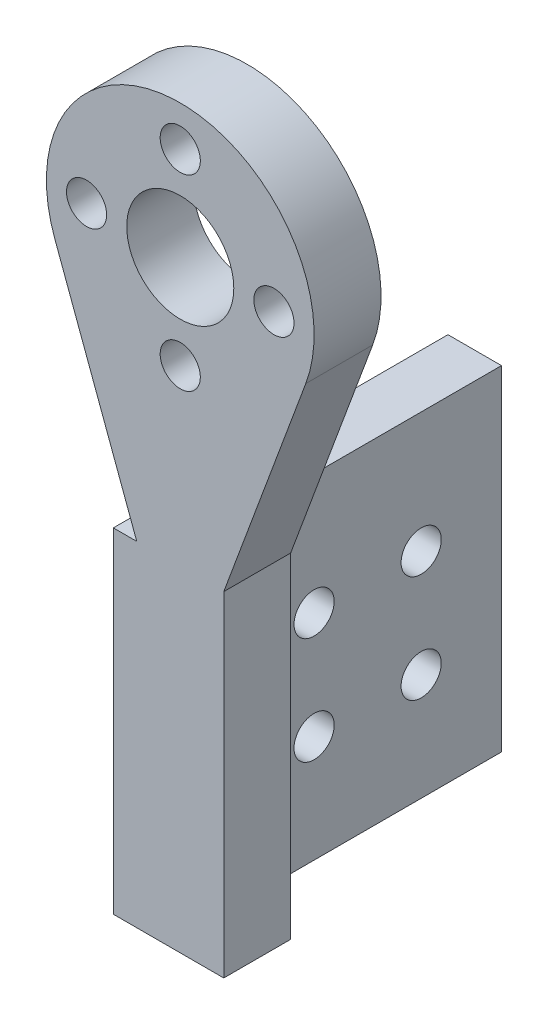
ISO-10303-21;
HEADER;
FILE_DESCRIPTION(('STEP AP214'),'2;1');
FILE_NAME('part.step','',(''),(''),'','','');
FILE_SCHEMA(('AUTOMOTIVE_DESIGN { 1 0 10303 214 1 1 1 1 }'));
ENDSEC;
DATA;
#1=APPLICATION_CONTEXT('core data for automotive mechanical design processes');
#2=APPLICATION_PROTOCOL_DEFINITION('international standard','automotive_design',2000,#1);
#3=PRODUCT_CONTEXT('',#1,'mechanical');
#4=PRODUCT('Part','Part','',(#3));
#5=PRODUCT_RELATED_PRODUCT_CATEGORY('part','',(#4));
#6=PRODUCT_DEFINITION_FORMATION('','',#4);
#7=PRODUCT_DEFINITION_CONTEXT('part definition',#1,'design');
#8=PRODUCT_DEFINITION('design','',#6,#7);
#9=PRODUCT_DEFINITION_SHAPE('','',#8);
#10=(LENGTH_UNIT() NAMED_UNIT(*) SI_UNIT(.MILLI.,.METRE.));
#11=(NAMED_UNIT(*) PLANE_ANGLE_UNIT() SI_UNIT($,.RADIAN.));
#12=(NAMED_UNIT(*) SI_UNIT($,.STERADIAN.) SOLID_ANGLE_UNIT());
#13=UNCERTAINTY_MEASURE_WITH_UNIT(LENGTH_MEASURE(1.E-05),#10,'distance_accuracy_value','');
#14=(GEOMETRIC_REPRESENTATION_CONTEXT(3) GLOBAL_UNCERTAINTY_ASSIGNED_CONTEXT((#13)) GLOBAL_UNIT_ASSIGNED_CONTEXT((#10,
#11,#12)) REPRESENTATION_CONTEXT('',''));
#15=CARTESIAN_POINT('',(0.,0.,0.));
#16=DIRECTION('',(0.,0.,1.));
#17=DIRECTION('',(1.,0.,0.));
#18=AXIS2_PLACEMENT_3D('',#15,#16,#17);
#19=CARTESIAN_POINT('',(0.,0.,5.));
#20=DIRECTION('',(0.,0.,-1.));
#21=DIRECTION('',(-1.,0.,0.));
#22=AXIS2_PLACEMENT_3D('',#19,#20,#21);
#23=PLANE('',#22);
#24=CARTESIAN_POINT('',(6.66884865732704,32.3881145780887,5.));
#25=DIRECTION('',(0.,0.,1.));
#26=DIRECTION('',(1.,0.,0.));
#27=AXIS2_PLACEMENT_3D('',#24,#25,#26);
#28=CIRCLE('',#27,1.5);
#29=CARTESIAN_POINT('',(8.16884865732705,32.3881145780887,5.));
#30=VERTEX_POINT('',#29);
#31=EDGE_CURVE('E192',#30,#30,#28,.T.);
#32=ORIENTED_EDGE('',*,*,#31,.F.);
#33=EDGE_LOOP('',(#32));
#34=FACE_BOUND('',#33,.T.);
#35=CARTESIAN_POINT('',(-0.331250810167493,39.3880005579145,5.));
#36=DIRECTION('',(0.,0.,1.));
#37=DIRECTION('',(1.,0.,0.));
#38=AXIS2_PLACEMENT_3D('',#35,#36,#37);
#39=CIRCLE('',#38,1.5);
#40=CARTESIAN_POINT('',(1.16874918983251,39.3880005579145,5.));
#41=VERTEX_POINT('',#40);
#42=EDGE_CURVE('E188',#41,#41,#39,.T.);
#43=ORIENTED_EDGE('',*,*,#42,.F.);
#44=EDGE_LOOP('',(#43));
#45=FACE_BOUND('',#44,.T.);
#46=CARTESIAN_POINT('',(-7.33125081016749,32.3880005579145,5.));
#47=DIRECTION('',(0.,0.,1.));
#48=DIRECTION('',(1.,0.,0.));
#49=AXIS2_PLACEMENT_3D('',#46,#47,#48);
#50=CIRCLE('',#49,1.5);
#51=CARTESIAN_POINT('',(-5.83125081016749,32.3880005579145,5.));
#52=VERTEX_POINT('',#51);
#53=EDGE_CURVE('E184',#52,#52,#50,.T.);
#54=ORIENTED_EDGE('',*,*,#53,.F.);
#55=EDGE_LOOP('',(#54));
#56=FACE_BOUND('',#55,.T.);
#57=CARTESIAN_POINT('',(-0.331250810167493,25.3880005579145,5.));
#58=DIRECTION('',(0.,0.,1.));
#59=DIRECTION('',(1.,0.,0.));
#60=AXIS2_PLACEMENT_3D('',#57,#58,#59);
#61=CIRCLE('',#60,1.5);
#62=CARTESIAN_POINT('',(1.16874918983251,25.3880005579145,5.));
#63=VERTEX_POINT('',#62);
#64=EDGE_CURVE('E180',#63,#63,#61,.T.);
#65=ORIENTED_EDGE('',*,*,#64,.F.);
#66=EDGE_LOOP('',(#65));
#67=FACE_BOUND('',#66,.T.);
#68=CARTESIAN_POINT('',(-0.331250810167493,32.3880005579145,5.));
#69=DIRECTION('',(0.,0.,1.));
#70=DIRECTION('',(1.,0.,0.));
#71=AXIS2_PLACEMENT_3D('',#68,#69,#70);
#72=CIRCLE('',#71,4.);
#73=CARTESIAN_POINT('',(3.66874918983251,32.3880005579145,5.));
#74=VERTEX_POINT('',#73);
#75=EDGE_CURVE('E151',#74,#74,#72,.T.);
#76=ORIENTED_EDGE('',*,*,#75,.F.);
#77=EDGE_LOOP('',(#76));
#78=FACE_BOUND('',#77,.T.);
#79=DIRECTION('',(0.,-1.,0.));
#80=VECTOR('',#79,1.);
#81=CARTESIAN_POINT('',(2.91884865732704,12.3881145780887,5.));
#82=LINE('',#81,#80);
#83=CARTESIAN_POINT('',(2.91884865732704,12.3881145780887,5.));
#84=VERTEX_POINT('',#83);
#85=CARTESIAN_POINT('',(2.91884865732705,-12.6118854219113,5.));
#86=VERTEX_POINT('',#85);
#87=EDGE_CURVE('E149',#84,#86,#82,.T.);
#88=ORIENTED_EDGE('',*,*,#87,.F.);
#89=DIRECTION('',(-0.347654551948024,-0.937622691976799,0.));
#90=VECTOR('',#89,1.);
#91=CARTESIAN_POINT('',(-1.47207295919862,0.545819623868128,5.));
#92=LINE('',#91,#90);
#93=CARTESIAN_POINT('',(9.04536842146665,28.9113095758647,5.));
#94=VERTEX_POINT('',#93);
#95=EDGE_CURVE('E141',#94,#84,#92,.T.);
#96=ORIENTED_EDGE('',*,*,#95,.F.);
#97=CARTESIAN_POINT('',(-0.331250810167493,32.3880005579145,5.));
#98=DIRECTION('',(0.,0.,1.));
#99=DIRECTION('',(1.,0.,0.));
#100=AXIS2_PLACEMENT_3D('',#97,#98,#99);
#101=CIRCLE('',#100,10.0004184112325);
#102=CARTESIAN_POINT('',(-9.70783324201889,28.911210328635,5.));
#103=VERTEX_POINT('',#102);
#104=EDGE_CURVE('E144',#103,#94,#101,.F.);
#105=ORIENTED_EDGE('',*,*,#104,.F.);
#106=DIRECTION('',(0.347664476255751,-0.937619012152492,0.));
#107=VECTOR('',#106,1.);
#108=CARTESIAN_POINT('',(0.889942756504651,0.32998635728119,5.));
#109=LINE('',#108,#107);
#110=CARTESIAN_POINT('',(-3.58115134267295,12.3881145780887,5.));
#111=VERTEX_POINT('',#110);
#112=EDGE_CURVE('E152',#103,#111,#109,.T.);
#113=ORIENTED_EDGE('',*,*,#112,.T.);
#114=DIRECTION('',(-1.,0.,0.));
#115=VECTOR('',#114,1.);
#116=CARTESIAN_POINT('',(-5.33120107642022,12.3881145780887,5.));
#117=LINE('',#116,#115);
#118=CARTESIAN_POINT('',(-5.33120107642022,12.3881145780887,5.));
#119=VERTEX_POINT('',#118);
#120=EDGE_CURVE('E428',#111,#119,#117,.T.);
#121=ORIENTED_EDGE('',*,*,#120,.T.);
#122=DIRECTION('',(0.,-1.,0.));
#123=VECTOR('',#122,1.);
#124=CARTESIAN_POINT('',(-5.33120107642022,12.3881145780887,5.));
#125=LINE('',#124,#123);
#126=CARTESIAN_POINT('',(-5.33120107642022,-12.6118854219113,5.));
#127=VERTEX_POINT('',#126);
#128=EDGE_CURVE('E443',#119,#127,#125,.T.);
#129=ORIENTED_EDGE('',*,*,#128,.T.);
#130=DIRECTION('',(1.,0.,0.));
#131=VECTOR('',#130,1.);
#132=CARTESIAN_POINT('',(-3.58115134267295,-12.6118854219113,5.));
#133=LINE('',#132,#131);
#134=EDGE_CURVE('E111',#127,#86,#133,.T.);
#135=ORIENTED_EDGE('',*,*,#134,.T.);
#136=EDGE_LOOP('',(#88,#96,#105,#113,#121,#129,#135));
#137=FACE_BOUND('',#136,.T.);
#138=ADVANCED_FACE('F101',(#34,#45,#56,#67,#78,#137),#23,.F.);
#139=CARTESIAN_POINT('',(-3.58115134267295,-12.6118854219113,5.));
#140=DIRECTION('',(0.,1.,0.));
#141=DIRECTION('',(0.,0.,1.));
#142=AXIS2_PLACEMENT_3D('',#139,#140,#141);
#143=PLANE('',#142);
#144=DIRECTION('',(0.,0.,-1.));
#145=VECTOR('',#144,1.);
#146=CARTESIAN_POINT('',(2.91884865732705,-12.6118854219113,5.));
#147=LINE('',#146,#145);
#148=CARTESIAN_POINT('',(2.91884865732705,-12.6118854219113,0.));
#149=VERTEX_POINT('',#148);
#150=EDGE_CURVE('E215',#86,#149,#147,.T.);
#151=ORIENTED_EDGE('',*,*,#150,.F.);
#152=ORIENTED_EDGE('',*,*,#134,.F.);
#153=DIRECTION('',(0.,0.,1.));
#154=VECTOR('',#153,1.);
#155=CARTESIAN_POINT('',(-5.33120107642022,-12.6118854219113,-20.));
#156=LINE('',#155,#154);
#157=CARTESIAN_POINT('',(-5.33120107642022,-12.6118854219113,-20.));
#158=VERTEX_POINT('',#157);
#159=EDGE_CURVE('E259',#158,#127,#156,.T.);
#160=ORIENTED_EDGE('',*,*,#159,.F.);
#161=DIRECTION('',(-1.,0.,0.));
#162=VECTOR('',#161,1.);
#163=CARTESIAN_POINT('',(0.,-12.6118854219113,-20.));
#164=LINE('',#163,#162);
#165=CARTESIAN_POINT('',(-1.33120107642022,-12.6118854219113,-20.));
#166=VERTEX_POINT('',#165);
#167=EDGE_CURVE('E255',#166,#158,#164,.T.);
#168=ORIENTED_EDGE('',*,*,#167,.F.);
#169=DIRECTION('',(0.,0.,1.));
#170=VECTOR('',#169,1.);
#171=CARTESIAN_POINT('',(-1.33120107642022,-12.6118854219113,-20.));
#172=LINE('',#171,#170);
#173=CARTESIAN_POINT('',(-1.33120107642022,-12.6118854219113,0.));
#174=VERTEX_POINT('',#173);
#175=EDGE_CURVE('E269',#166,#174,#172,.T.);
#176=ORIENTED_EDGE('',*,*,#175,.T.);
#177=DIRECTION('',(1.,0.,0.));
#178=VECTOR('',#177,1.);
#179=CARTESIAN_POINT('',(-3.58115134267295,-12.6118854219113,0.));
#180=LINE('',#179,#178);
#181=EDGE_CURVE('E204',#174,#149,#180,.T.);
#182=ORIENTED_EDGE('',*,*,#181,.T.);
#183=EDGE_LOOP('',(#151,#152,#160,#168,#176,#182));
#184=FACE_BOUND('',#183,.T.);
#185=ADVANCED_FACE('F103',(#184),#143,.F.);
#186=CARTESIAN_POINT('',(0.,0.,0.));
#187=DIRECTION('',(0.,0.,-1.));
#188=DIRECTION('',(-1.,0.,0.));
#189=AXIS2_PLACEMENT_3D('',#186,#187,#188);
#190=PLANE('',#189);
#191=CARTESIAN_POINT('',(-0.331250810167493,32.3880005579145,0.));
#192=DIRECTION('',(0.,0.,1.));
#193=DIRECTION('',(1.,0.,0.));
#194=AXIS2_PLACEMENT_3D('',#191,#192,#193);
#195=CIRCLE('',#194,4.);
#196=CARTESIAN_POINT('',(3.66874918983251,32.3880005579145,0.));
#197=VERTEX_POINT('',#196);
#198=EDGE_CURVE('E284',#197,#197,#195,.T.);
#199=ORIENTED_EDGE('',*,*,#198,.T.);
#200=EDGE_LOOP('',(#199));
#201=FACE_BOUND('',#200,.T.);
#202=CARTESIAN_POINT('',(-0.331250810167493,25.3880005579145,0.));
#203=DIRECTION('',(0.,0.,1.));
#204=DIRECTION('',(1.,0.,0.));
#205=AXIS2_PLACEMENT_3D('',#202,#203,#204);
#206=CIRCLE('',#205,1.5);
#207=CARTESIAN_POINT('',(1.16874918983251,25.3880005579145,0.));
#208=VERTEX_POINT('',#207);
#209=EDGE_CURVE('E288',#208,#208,#206,.T.);
#210=ORIENTED_EDGE('',*,*,#209,.T.);
#211=EDGE_LOOP('',(#210));
#212=FACE_BOUND('',#211,.T.);
#213=CARTESIAN_POINT('',(-7.33125081016749,32.3880005579145,0.));
#214=DIRECTION('',(0.,0.,1.));
#215=DIRECTION('',(1.,0.,0.));
#216=AXIS2_PLACEMENT_3D('',#213,#214,#215);
#217=CIRCLE('',#216,1.5);
#218=CARTESIAN_POINT('',(-5.83125081016749,32.3880005579145,0.));
#219=VERTEX_POINT('',#218);
#220=EDGE_CURVE('E292',#219,#219,#217,.T.);
#221=ORIENTED_EDGE('',*,*,#220,.T.);
#222=EDGE_LOOP('',(#221));
#223=FACE_BOUND('',#222,.T.);
#224=CARTESIAN_POINT('',(-0.331250810167493,39.3880005579145,0.));
#225=DIRECTION('',(0.,0.,1.));
#226=DIRECTION('',(1.,0.,0.));
#227=AXIS2_PLACEMENT_3D('',#224,#225,#226);
#228=CIRCLE('',#227,1.5);
#229=CARTESIAN_POINT('',(1.16874918983251,39.3880005579145,0.));
#230=VERTEX_POINT('',#229);
#231=EDGE_CURVE('E295',#230,#230,#228,.T.);
#232=ORIENTED_EDGE('',*,*,#231,.T.);
#233=EDGE_LOOP('',(#232));
#234=FACE_BOUND('',#233,.T.);
#235=CARTESIAN_POINT('',(6.66884865732704,32.3881145780887,0.));
#236=DIRECTION('',(0.,0.,1.));
#237=DIRECTION('',(1.,0.,0.));
#238=AXIS2_PLACEMENT_3D('',#235,#236,#237);
#239=CIRCLE('',#238,1.5);
#240=CARTESIAN_POINT('',(8.16884865732705,32.3881145780887,0.));
#241=VERTEX_POINT('',#240);
#242=EDGE_CURVE('E174',#241,#241,#239,.T.);
#243=ORIENTED_EDGE('',*,*,#242,.T.);
#244=EDGE_LOOP('',(#243));
#245=FACE_BOUND('',#244,.T.);
#246=DIRECTION('',(0.,-1.,0.));
#247=VECTOR('',#246,1.);
#248=CARTESIAN_POINT('',(-1.33120107642022,0.,0.));
#249=LINE('',#248,#247);
#250=CARTESIAN_POINT('',(-1.33120107642022,12.3881145780887,0.));
#251=VERTEX_POINT('',#250);
#252=EDGE_CURVE('E247',#251,#174,#249,.T.);
#253=ORIENTED_EDGE('',*,*,#252,.F.);
#254=DIRECTION('',(1.,0.,0.));
#255=VECTOR('',#254,1.);
#256=CARTESIAN_POINT('',(0.,12.3881145780887,0.));
#257=LINE('',#256,#255);
#258=CARTESIAN_POINT('',(-3.58115134267295,12.3881145780887,0.));
#259=VERTEX_POINT('',#258);
#260=EDGE_CURVE('E241',#259,#251,#257,.T.);
#261=ORIENTED_EDGE('',*,*,#260,.F.);
#262=DIRECTION('',(0.347664476255751,-0.937619012152492,0.));
#263=VECTOR('',#262,1.);
#264=CARTESIAN_POINT('',(0.889942756504651,0.32998635728119,0.));
#265=LINE('',#264,#263);
#266=CARTESIAN_POINT('',(-9.70783324201889,28.911210328635,0.));
#267=VERTEX_POINT('',#266);
#268=EDGE_CURVE('E278',#267,#259,#265,.T.);
#269=ORIENTED_EDGE('',*,*,#268,.F.);
#270=CARTESIAN_POINT('',(-0.331250810167493,32.3880005579145,0.));
#271=DIRECTION('',(0.,0.,1.));
#272=DIRECTION('',(1.,0.,0.));
#273=AXIS2_PLACEMENT_3D('',#270,#271,#272);
#274=CIRCLE('',#273,10.0004184112325);
#275=CARTESIAN_POINT('',(9.04536842146665,28.9113095758647,0.));
#276=VERTEX_POINT('',#275);
#277=EDGE_CURVE('E195',#267,#276,#274,.F.);
#278=ORIENTED_EDGE('',*,*,#277,.T.);
#279=DIRECTION('',(-0.347654551948024,-0.937622691976799,0.));
#280=VECTOR('',#279,1.);
#281=CARTESIAN_POINT('',(-1.47207295919862,0.545819623868128,0.));
#282=LINE('',#281,#280);
#283=CARTESIAN_POINT('',(2.91884865732704,12.3881145780887,0.));
#284=VERTEX_POINT('',#283);
#285=EDGE_CURVE('E126',#276,#284,#282,.T.);
#286=ORIENTED_EDGE('',*,*,#285,.T.);
#287=DIRECTION('',(0.,1.,0.));
#288=VECTOR('',#287,1.);
#289=CARTESIAN_POINT('',(2.91884865732704,12.3881145780887,0.));
#290=LINE('',#289,#288);
#291=EDGE_CURVE('E119',#149,#284,#290,.T.);
#292=ORIENTED_EDGE('',*,*,#291,.F.);
#293=ORIENTED_EDGE('',*,*,#181,.F.);
#294=EDGE_LOOP('',(#253,#261,#269,#278,#286,#292,#293));
#295=FACE_BOUND('',#294,.T.);
#296=ADVANCED_FACE('F304',(#201,#212,#223,#234,#245,#295),#190,.T.);
#297=CARTESIAN_POINT('',(-0.331250810167493,32.3880005579145,0.));
#298=DIRECTION('',(0.,0.,1.));
#299=DIRECTION('',(1.,0.,0.));
#300=AXIS2_PLACEMENT_3D('',#297,#298,#299);
#301=CYLINDRICAL_SURFACE('',#300,10.0004184112325);
#302=ORIENTED_EDGE('',*,*,#104,.T.);
#303=DIRECTION('',(0.,0.,1.));
#304=VECTOR('',#303,1.);
#305=CARTESIAN_POINT('',(9.04536842146665,28.9113095758647,0.));
#306=LINE('',#305,#304);
#307=EDGE_CURVE('E155',#276,#94,#306,.T.);
#308=ORIENTED_EDGE('',*,*,#307,.F.);
#309=ORIENTED_EDGE('',*,*,#277,.F.);
#310=DIRECTION('',(0.,0.,1.));
#311=VECTOR('',#310,1.);
#312=CARTESIAN_POINT('',(-9.70783324201889,28.911210328635,0.));
#313=LINE('',#312,#311);
#314=EDGE_CURVE('E163',#267,#103,#313,.T.);
#315=ORIENTED_EDGE('',*,*,#314,.T.);
#316=EDGE_LOOP('',(#302,#308,#309,#315));
#317=FACE_BOUND('',#316,.T.);
#318=ADVANCED_FACE('F162',(#317),#301,.T.);
#319=CARTESIAN_POINT('',(-1.47207295919862,0.545819623868128,0.));
#320=DIRECTION('',(-0.937622691976799,0.347654551948024,0.));
#321=DIRECTION('',(-0.347654551948024,-0.937622691976799,0.));
#322=AXIS2_PLACEMENT_3D('',#319,#320,#321);
#323=PLANE('',#322);
#324=ORIENTED_EDGE('',*,*,#95,.T.);
#325=DIRECTION('',(0.,0.,-1.));
#326=VECTOR('',#325,1.);
#327=CARTESIAN_POINT('',(2.91884865732704,12.3881145780887,5.));
#328=LINE('',#327,#326);
#329=EDGE_CURVE('E12',#84,#284,#328,.T.);
#330=ORIENTED_EDGE('',*,*,#329,.T.);
#331=ORIENTED_EDGE('',*,*,#285,.F.);
#332=ORIENTED_EDGE('',*,*,#307,.T.);
#333=EDGE_LOOP('',(#324,#330,#331,#332));
#334=FACE_BOUND('',#333,.T.);
#335=ADVANCED_FACE('F156',(#334),#323,.F.);
#336=CARTESIAN_POINT('',(-0.331250810167493,39.3880005579145,0.));
#337=DIRECTION('',(0.,0.,1.));
#338=DIRECTION('',(1.,0.,0.));
#339=AXIS2_PLACEMENT_3D('',#336,#337,#338);
#340=CYLINDRICAL_SURFACE('',#339,1.5);
#341=ORIENTED_EDGE('',*,*,#231,.F.);
#342=EDGE_LOOP('',(#341));
#343=FACE_BOUND('',#342,.T.);
#344=ORIENTED_EDGE('',*,*,#42,.T.);
#345=EDGE_LOOP('',(#344));
#346=FACE_BOUND('',#345,.T.);
#347=ADVANCED_FACE('F344',(#343,#346),#340,.F.);
#348=CARTESIAN_POINT('',(-7.33125081016749,32.3880005579145,0.));
#349=DIRECTION('',(0.,0.,1.));
#350=DIRECTION('',(1.,0.,0.));
#351=AXIS2_PLACEMENT_3D('',#348,#349,#350);
#352=CYLINDRICAL_SURFACE('',#351,1.5);
#353=ORIENTED_EDGE('',*,*,#220,.F.);
#354=EDGE_LOOP('',(#353));
#355=FACE_BOUND('',#354,.T.);
#356=ORIENTED_EDGE('',*,*,#53,.T.);
#357=EDGE_LOOP('',(#356));
#358=FACE_BOUND('',#357,.T.);
#359=ADVANCED_FACE('F337',(#355,#358),#352,.F.);
#360=CARTESIAN_POINT('',(-0.331250810167493,25.3880005579145,0.));
#361=DIRECTION('',(0.,0.,1.));
#362=DIRECTION('',(1.,0.,0.));
#363=AXIS2_PLACEMENT_3D('',#360,#361,#362);
#364=CYLINDRICAL_SURFACE('',#363,1.5);
#365=ORIENTED_EDGE('',*,*,#209,.F.);
#366=EDGE_LOOP('',(#365));
#367=FACE_BOUND('',#366,.T.);
#368=ORIENTED_EDGE('',*,*,#64,.T.);
#369=EDGE_LOOP('',(#368));
#370=FACE_BOUND('',#369,.T.);
#371=ADVANCED_FACE('F328',(#367,#370),#364,.F.);
#372=CARTESIAN_POINT('',(-0.331250810167493,32.3880005579145,0.));
#373=DIRECTION('',(0.,0.,1.));
#374=DIRECTION('',(1.,0.,0.));
#375=AXIS2_PLACEMENT_3D('',#372,#373,#374);
#376=CYLINDRICAL_SURFACE('',#375,4.);
#377=ORIENTED_EDGE('',*,*,#198,.F.);
#378=EDGE_LOOP('',(#377));
#379=FACE_BOUND('',#378,.T.);
#380=ORIENTED_EDGE('',*,*,#75,.T.);
#381=EDGE_LOOP('',(#380));
#382=FACE_BOUND('',#381,.T.);
#383=ADVANCED_FACE('F326',(#379,#382),#376,.F.);
#384=CARTESIAN_POINT('',(0.889942756504651,0.32998635728119,0.));
#385=DIRECTION('',(-0.937619012152492,-0.34766447625575,0.));
#386=DIRECTION('',(0.34766447625575,-0.937619012152492,0.));
#387=AXIS2_PLACEMENT_3D('',#384,#385,#386);
#388=PLANE('',#387);
#389=ORIENTED_EDGE('',*,*,#112,.F.);
#390=ORIENTED_EDGE('',*,*,#314,.F.);
#391=ORIENTED_EDGE('',*,*,#268,.T.);
#392=DIRECTION('',(0.,0.,1.));
#393=VECTOR('',#392,1.);
#394=CARTESIAN_POINT('',(-3.58115134267295,12.3881145780887,0.));
#395=LINE('',#394,#393);
#396=EDGE_CURVE('E160',#259,#111,#395,.T.);
#397=ORIENTED_EDGE('',*,*,#396,.T.);
#398=EDGE_LOOP('',(#389,#390,#391,#397));
#399=FACE_BOUND('',#398,.T.);
#400=ADVANCED_FACE('F311',(#399),#388,.T.);
#401=CARTESIAN_POINT('',(6.66884865732704,32.3881145780887,0.));
#402=DIRECTION('',(0.,0.,1.));
#403=DIRECTION('',(1.,0.,0.));
#404=AXIS2_PLACEMENT_3D('',#401,#402,#403);
#405=CYLINDRICAL_SURFACE('',#404,1.5);
#406=ORIENTED_EDGE('',*,*,#242,.F.);
#407=EDGE_LOOP('',(#406));
#408=FACE_BOUND('',#407,.T.);
#409=ORIENTED_EDGE('',*,*,#31,.T.);
#410=EDGE_LOOP('',(#409));
#411=FACE_BOUND('',#410,.T.);
#412=ADVANCED_FACE('F307',(#408,#411),#405,.F.);
#413=CARTESIAN_POINT('',(-5.33120107642022,0.,-20.));
#414=DIRECTION('',(1.,0.,0.));
#415=DIRECTION('',(0.,0.,-1.));
#416=AXIS2_PLACEMENT_3D('',#413,#414,#415);
#417=PLANE('',#416);
#418=CARTESIAN_POINT('',(-5.33120107642022,3.38811457808874,-14.));
#419=DIRECTION('',(1.,0.,0.));
#420=DIRECTION('',(0.,0.,-1.));
#421=AXIS2_PLACEMENT_3D('',#418,#419,#420);
#422=CIRCLE('',#421,1.5);
#423=CARTESIAN_POINT('',(-5.33120107642022,3.38811457808874,-15.5));
#424=VERTEX_POINT('',#423);
#425=EDGE_CURVE('E237',#424,#424,#422,.T.);
#426=ORIENTED_EDGE('',*,*,#425,.T.);
#427=EDGE_LOOP('',(#426));
#428=FACE_BOUND('',#427,.T.);
#429=CARTESIAN_POINT('',(-5.33120107642022,-4.61188542191126,-6.));
#430=DIRECTION('',(1.,0.,0.));
#431=DIRECTION('',(0.,0.,-1.));
#432=AXIS2_PLACEMENT_3D('',#429,#430,#431);
#433=CIRCLE('',#432,1.5);
#434=CARTESIAN_POINT('',(-5.33120107642022,-4.61188542191126,-7.5));
#435=VERTEX_POINT('',#434);
#436=EDGE_CURVE('E223',#435,#435,#433,.T.);
#437=ORIENTED_EDGE('',*,*,#436,.T.);
#438=EDGE_LOOP('',(#437));
#439=FACE_BOUND('',#438,.T.);
#440=CARTESIAN_POINT('',(-5.33120107642022,-4.61188542191126,-14.));
#441=DIRECTION('',(1.,0.,0.));
#442=DIRECTION('',(0.,0.,-1.));
#443=AXIS2_PLACEMENT_3D('',#440,#441,#442);
#444=CIRCLE('',#443,1.5);
#445=CARTESIAN_POINT('',(-5.33120107642022,-4.61188542191126,-15.5));
#446=VERTEX_POINT('',#445);
#447=EDGE_CURVE('E219',#446,#446,#444,.T.);
#448=ORIENTED_EDGE('',*,*,#447,.T.);
#449=EDGE_LOOP('',(#448));
#450=FACE_BOUND('',#449,.T.);
#451=CARTESIAN_POINT('',(-5.33120107642022,3.38811457808874,-6.));
#452=DIRECTION('',(1.,0.,0.));
#453=DIRECTION('',(0.,0.,-1.));
#454=AXIS2_PLACEMENT_3D('',#451,#452,#453);
#455=CIRCLE('',#454,1.5);
#456=CARTESIAN_POINT('',(-5.33120107642022,3.38811457808874,-7.5));
#457=VERTEX_POINT('',#456);
#458=EDGE_CURVE('E214',#457,#457,#455,.T.);
#459=ORIENTED_EDGE('',*,*,#458,.T.);
#460=EDGE_LOOP('',(#459));
#461=FACE_BOUND('',#460,.T.);
#462=ORIENTED_EDGE('',*,*,#159,.T.);
#463=ORIENTED_EDGE('',*,*,#128,.F.);
#464=DIRECTION('',(0.,0.,1.));
#465=VECTOR('',#464,1.);
#466=CARTESIAN_POINT('',(-5.33120107642022,12.3881145780887,-20.));
#467=LINE('',#466,#465);
#468=CARTESIAN_POINT('',(-5.33120107642022,12.3881145780887,-20.));
#469=VERTEX_POINT('',#468);
#470=EDGE_CURVE('E165',#469,#119,#467,.T.);
#471=ORIENTED_EDGE('',*,*,#470,.F.);
#472=DIRECTION('',(0.,1.,0.));
#473=VECTOR('',#472,1.);
#474=CARTESIAN_POINT('',(-5.33120107642022,0.,-20.));
#475=LINE('',#474,#473);
#476=EDGE_CURVE('E242',#158,#469,#475,.T.);
#477=ORIENTED_EDGE('',*,*,#476,.F.);
#478=EDGE_LOOP('',(#462,#463,#471,#477));
#479=FACE_BOUND('',#478,.T.);
#480=ADVANCED_FACE('F310',(#428,#439,#450,#461,#479),#417,.F.);
#481=CARTESIAN_POINT('',(0.,12.3881145780887,-20.));
#482=DIRECTION('',(0.,-1.,0.));
#483=DIRECTION('',(0.,0.,-1.));
#484=AXIS2_PLACEMENT_3D('',#481,#482,#483);
#485=PLANE('',#484);
#486=ORIENTED_EDGE('',*,*,#470,.T.);
#487=ORIENTED_EDGE('',*,*,#120,.F.);
#488=ORIENTED_EDGE('',*,*,#396,.F.);
#489=ORIENTED_EDGE('',*,*,#260,.T.);
#490=DIRECTION('',(0.,0.,1.));
#491=VECTOR('',#490,1.);
#492=CARTESIAN_POINT('',(-1.33120107642022,12.3881145780887,-20.));
#493=LINE('',#492,#491);
#494=CARTESIAN_POINT('',(-1.33120107642022,12.3881145780887,-20.));
#495=VERTEX_POINT('',#494);
#496=EDGE_CURVE('E171',#495,#251,#493,.T.);
#497=ORIENTED_EDGE('',*,*,#496,.F.);
#498=DIRECTION('',(1.,0.,0.));
#499=VECTOR('',#498,1.);
#500=CARTESIAN_POINT('',(0.,12.3881145780887,-20.));
#501=LINE('',#500,#499);
#502=EDGE_CURVE('E246',#469,#495,#501,.T.);
#503=ORIENTED_EDGE('',*,*,#502,.F.);
#504=EDGE_LOOP('',(#486,#487,#488,#489,#497,#503));
#505=FACE_BOUND('',#504,.T.);
#506=ADVANCED_FACE('F368',(#505),#485,.F.);
#507=CARTESIAN_POINT('',(-1.33120107642022,0.,-20.));
#508=DIRECTION('',(-1.,0.,0.));
#509=DIRECTION('',(0.,0.,1.));
#510=AXIS2_PLACEMENT_3D('',#507,#508,#509);
#511=PLANE('',#510);
#512=CARTESIAN_POINT('',(-1.33120107642022,3.38811457808874,-14.));
#513=DIRECTION('',(-1.,0.,0.));
#514=DIRECTION('',(0.,0.,1.));
#515=AXIS2_PLACEMENT_3D('',#512,#513,#514);
#516=CIRCLE('',#515,1.5);
#517=CARTESIAN_POINT('',(-1.33120107642022,3.38811457808874,-12.5));
#518=VERTEX_POINT('',#517);
#519=EDGE_CURVE('E105',#518,#518,#516,.T.);
#520=ORIENTED_EDGE('',*,*,#519,.T.);
#521=EDGE_LOOP('',(#520));
#522=FACE_BOUND('',#521,.T.);
#523=CARTESIAN_POINT('',(-1.33120107642022,-4.61188542191126,-6.));
#524=DIRECTION('',(-1.,0.,0.));
#525=DIRECTION('',(0.,0.,1.));
#526=AXIS2_PLACEMENT_3D('',#523,#524,#525);
#527=CIRCLE('',#526,1.5);
#528=CARTESIAN_POINT('',(-1.33120107642022,-4.61188542191126,-4.5));
#529=VERTEX_POINT('',#528);
#530=EDGE_CURVE('E220',#529,#529,#527,.T.);
#531=ORIENTED_EDGE('',*,*,#530,.T.);
#532=EDGE_LOOP('',(#531));
#533=FACE_BOUND('',#532,.T.);
#534=CARTESIAN_POINT('',(-1.33120107642022,-4.61188542191126,-14.));
#535=DIRECTION('',(-1.,0.,0.));
#536=DIRECTION('',(0.,0.,1.));
#537=AXIS2_PLACEMENT_3D('',#534,#535,#536);
#538=CIRCLE('',#537,1.5);
#539=CARTESIAN_POINT('',(-1.33120107642022,-4.61188542191126,-12.5));
#540=VERTEX_POINT('',#539);
#541=EDGE_CURVE('E216',#540,#540,#538,.T.);
#542=ORIENTED_EDGE('',*,*,#541,.T.);
#543=EDGE_LOOP('',(#542));
#544=FACE_BOUND('',#543,.T.);
#545=CARTESIAN_POINT('',(-1.33120107642022,3.38811457808874,-6.));
#546=DIRECTION('',(-1.,0.,0.));
#547=DIRECTION('',(0.,0.,1.));
#548=AXIS2_PLACEMENT_3D('',#545,#546,#547);
#549=CIRCLE('',#548,1.5);
#550=CARTESIAN_POINT('',(-1.33120107642022,3.38811457808874,-4.5));
#551=VERTEX_POINT('',#550);
#552=EDGE_CURVE('E210',#551,#551,#549,.T.);
#553=ORIENTED_EDGE('',*,*,#552,.T.);
#554=EDGE_LOOP('',(#553));
#555=FACE_BOUND('',#554,.T.);
#556=ORIENTED_EDGE('',*,*,#252,.T.);
#557=ORIENTED_EDGE('',*,*,#175,.F.);
#558=DIRECTION('',(0.,-1.,0.));
#559=VECTOR('',#558,1.);
#560=CARTESIAN_POINT('',(-1.33120107642022,0.,-20.));
#561=LINE('',#560,#559);
#562=EDGE_CURVE('E251',#495,#166,#561,.T.);
#563=ORIENTED_EDGE('',*,*,#562,.F.);
#564=ORIENTED_EDGE('',*,*,#496,.T.);
#565=EDGE_LOOP('',(#556,#557,#563,#564));
#566=FACE_BOUND('',#565,.T.);
#567=ADVANCED_FACE('F372',(#522,#533,#544,#555,#566),#511,.F.);
#568=CARTESIAN_POINT('',(0.,0.,-20.));
#569=DIRECTION('',(0.,0.,-1.));
#570=DIRECTION('',(-1.,0.,0.));
#571=AXIS2_PLACEMENT_3D('',#568,#569,#570);
#572=PLANE('',#571);
#573=ORIENTED_EDGE('',*,*,#476,.T.);
#574=ORIENTED_EDGE('',*,*,#502,.T.);
#575=ORIENTED_EDGE('',*,*,#562,.T.);
#576=ORIENTED_EDGE('',*,*,#167,.T.);
#577=EDGE_LOOP('',(#573,#574,#575,#576));
#578=FACE_BOUND('',#577,.T.);
#579=ADVANCED_FACE('F376',(#578),#572,.T.);
#580=CARTESIAN_POINT('',(-13.081151342673,3.38811457808874,-6.));
#581=DIRECTION('',(1.,0.,0.));
#582=DIRECTION('',(0.,1.,0.));
#583=AXIS2_PLACEMENT_3D('',#580,#581,#582);
#584=CYLINDRICAL_SURFACE('',#583,1.5);
#585=ORIENTED_EDGE('',*,*,#552,.F.);
#586=EDGE_LOOP('',(#585));
#587=FACE_BOUND('',#586,.T.);
#588=ORIENTED_EDGE('',*,*,#458,.F.);
#589=EDGE_LOOP('',(#588));
#590=FACE_BOUND('',#589,.T.);
#591=ADVANCED_FACE('F380',(#587,#590),#584,.F.);
#592=CARTESIAN_POINT('',(-13.081151342673,-4.61188542191126,-14.));
#593=DIRECTION('',(1.,0.,0.));
#594=DIRECTION('',(0.,1.,0.));
#595=AXIS2_PLACEMENT_3D('',#592,#593,#594);
#596=CYLINDRICAL_SURFACE('',#595,1.5);
#597=ORIENTED_EDGE('',*,*,#541,.F.);
#598=EDGE_LOOP('',(#597));
#599=FACE_BOUND('',#598,.T.);
#600=ORIENTED_EDGE('',*,*,#447,.F.);
#601=EDGE_LOOP('',(#600));
#602=FACE_BOUND('',#601,.T.);
#603=ADVANCED_FACE('F384',(#599,#602),#596,.F.);
#604=CARTESIAN_POINT('',(-13.081151342673,-4.61188542191126,-6.));
#605=DIRECTION('',(1.,0.,0.));
#606=DIRECTION('',(0.,1.,0.));
#607=AXIS2_PLACEMENT_3D('',#604,#605,#606);
#608=CYLINDRICAL_SURFACE('',#607,1.5);
#609=ORIENTED_EDGE('',*,*,#530,.F.);
#610=EDGE_LOOP('',(#609));
#611=FACE_BOUND('',#610,.T.);
#612=ORIENTED_EDGE('',*,*,#436,.F.);
#613=EDGE_LOOP('',(#612));
#614=FACE_BOUND('',#613,.T.);
#615=ADVANCED_FACE('F386',(#611,#614),#608,.F.);
#616=CARTESIAN_POINT('',(-13.081151342673,3.38811457808874,-14.));
#617=DIRECTION('',(1.,0.,0.));
#618=DIRECTION('',(0.,1.,0.));
#619=AXIS2_PLACEMENT_3D('',#616,#617,#618);
#620=CYLINDRICAL_SURFACE('',#619,1.5);
#621=ORIENTED_EDGE('',*,*,#519,.F.);
#622=EDGE_LOOP('',(#621));
#623=FACE_BOUND('',#622,.T.);
#624=ORIENTED_EDGE('',*,*,#425,.F.);
#625=EDGE_LOOP('',(#624));
#626=FACE_BOUND('',#625,.T.);
#627=ADVANCED_FACE('F389',(#623,#626),#620,.F.);
#628=CARTESIAN_POINT('',(2.91884865732704,0.,0.));
#629=DIRECTION('',(1.,0.,0.));
#630=DIRECTION('',(0.,1.,0.));
#631=AXIS2_PLACEMENT_3D('',#628,#629,#630);
#632=PLANE('',#631);
#633=ORIENTED_EDGE('',*,*,#329,.F.);
#634=ORIENTED_EDGE('',*,*,#87,.T.);
#635=ORIENTED_EDGE('',*,*,#150,.T.);
#636=ORIENTED_EDGE('',*,*,#291,.T.);
#637=EDGE_LOOP('',(#633,#634,#635,#636));
#638=FACE_BOUND('',#637,.T.);
#639=ADVANCED_FACE('F393',(#638),#632,.T.);
#640=CLOSED_SHELL('',(#138,#185,#296,#318,#335,#347,#359,#371,#383,#400,#412,#480,#506,#567,
#579,#591,#603,#615,#627,#639));
#641=MANIFOLD_SOLID_BREP('B2',#640);
#642=ADVANCED_BREP_SHAPE_REPRESENTATION('',(#18,#641),#14);
#643=SHAPE_DEFINITION_REPRESENTATION(#9,#642);
ENDSEC;
END-ISO-10303-21;
